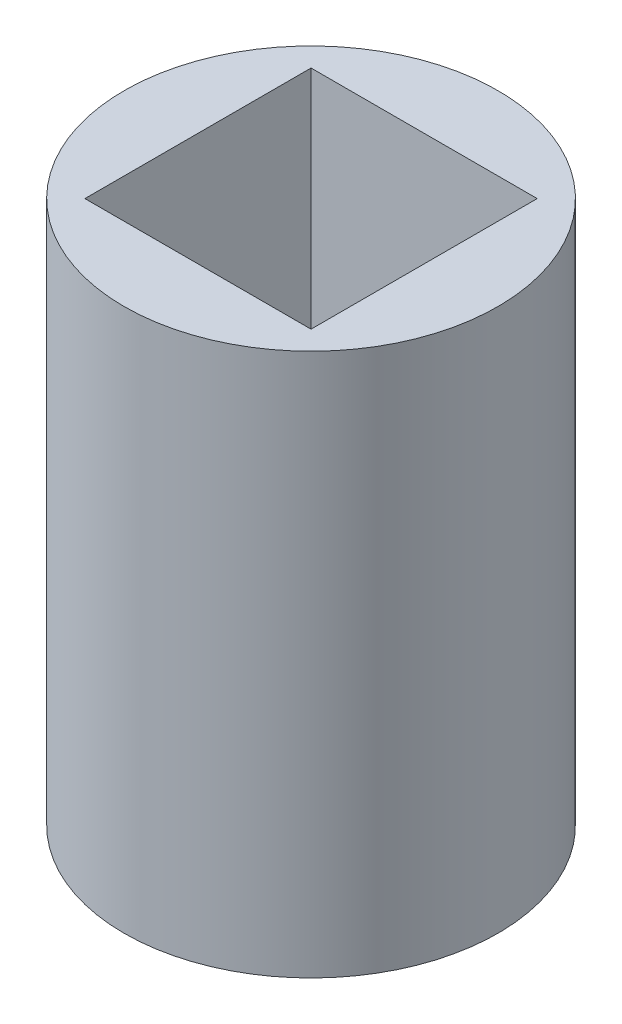
ISO-10303-21;
HEADER;
FILE_DESCRIPTION(('STEP AP214'),'2;1');
FILE_NAME('part.step','',(''),(''),'','','');
FILE_SCHEMA(('AUTOMOTIVE_DESIGN { 1 0 10303 214 1 1 1 1 }'));
ENDSEC;
DATA;
#1=APPLICATION_CONTEXT('core data for automotive mechanical design processes');
#2=APPLICATION_PROTOCOL_DEFINITION('international standard','automotive_design',2000,#1);
#3=PRODUCT_CONTEXT('',#1,'mechanical');
#4=PRODUCT('Part','Part','',(#3));
#5=PRODUCT_RELATED_PRODUCT_CATEGORY('part','',(#4));
#6=PRODUCT_DEFINITION_FORMATION('','',#4);
#7=PRODUCT_DEFINITION_CONTEXT('part definition',#1,'design');
#8=PRODUCT_DEFINITION('design','',#6,#7);
#9=PRODUCT_DEFINITION_SHAPE('','',#8);
#10=(LENGTH_UNIT() NAMED_UNIT(*) SI_UNIT(.MILLI.,.METRE.));
#11=(NAMED_UNIT(*) PLANE_ANGLE_UNIT() SI_UNIT($,.RADIAN.));
#12=(NAMED_UNIT(*) SI_UNIT($,.STERADIAN.) SOLID_ANGLE_UNIT());
#13=UNCERTAINTY_MEASURE_WITH_UNIT(LENGTH_MEASURE(1.E-05),#10,'distance_accuracy_value','');
#14=(GEOMETRIC_REPRESENTATION_CONTEXT(3) GLOBAL_UNCERTAINTY_ASSIGNED_CONTEXT((#13)) GLOBAL_UNIT_ASSIGNED_CONTEXT((#10,
#11,#12)) REPRESENTATION_CONTEXT('',''));
#15=CARTESIAN_POINT('',(0.,0.,0.));
#16=DIRECTION('',(0.,0.,1.));
#17=DIRECTION('',(1.,0.,0.));
#18=AXIS2_PLACEMENT_3D('',#15,#16,#17);
#19=CARTESIAN_POINT('',(0.,22.86,0.));
#20=DIRECTION('',(0.,1.,0.));
#21=DIRECTION('',(0.,0.,1.));
#22=AXIS2_PLACEMENT_3D('',#19,#20,#21);
#23=PLANE('',#22);
#24=CARTESIAN_POINT('',(0.,22.86,0.));
#25=DIRECTION('',(0.,1.,0.));
#26=DIRECTION('',(0.,0.,1.));
#27=AXIS2_PLACEMENT_3D('',#24,#25,#26);
#28=CIRCLE('',#27,7.87400000000001);
#29=CARTESIAN_POINT('',(0.,22.86,7.87400000000001));
#30=VERTEX_POINT('',#29);
#31=EDGE_CURVE('E11',#30,#30,#28,.T.);
#32=ORIENTED_EDGE('',*,*,#31,.T.);
#33=EDGE_LOOP('',(#32));
#34=FACE_BOUND('',#33,.T.);
#35=DIRECTION('',(-1.,0.,0.));
#36=VECTOR('',#35,1.);
#37=CARTESIAN_POINT('',(-4.7625,22.86,-4.7625));
#38=LINE('',#37,#36);
#39=CARTESIAN_POINT('',(4.7625,22.86,-4.7625));
#40=VERTEX_POINT('',#39);
#41=CARTESIAN_POINT('',(-4.7625,22.86,-4.7625));
#42=VERTEX_POINT('',#41);
#43=EDGE_CURVE('E81',#40,#42,#38,.T.);
#44=ORIENTED_EDGE('',*,*,#43,.F.);
#45=DIRECTION('',(0.,0.,-1.));
#46=VECTOR('',#45,1.);
#47=CARTESIAN_POINT('',(4.7625,22.86,4.7625));
#48=LINE('',#47,#46);
#49=CARTESIAN_POINT('',(4.7625,22.86,4.7625));
#50=VERTEX_POINT('',#49);
#51=EDGE_CURVE('E73',#50,#40,#48,.T.);
#52=ORIENTED_EDGE('',*,*,#51,.F.);
#53=DIRECTION('',(1.,0.,0.));
#54=VECTOR('',#53,1.);
#55=CARTESIAN_POINT('',(-4.7625,22.86,4.7625));
#56=LINE('',#55,#54);
#57=CARTESIAN_POINT('',(-4.7625,22.86,4.7625));
#58=VERTEX_POINT('',#57);
#59=EDGE_CURVE('E94',#58,#50,#56,.T.);
#60=ORIENTED_EDGE('',*,*,#59,.F.);
#61=DIRECTION('',(0.,0.,1.));
#62=VECTOR('',#61,1.);
#63=CARTESIAN_POINT('',(-4.7625,22.86,4.7625));
#64=LINE('',#63,#62);
#65=EDGE_CURVE('E92',#42,#58,#64,.T.);
#66=ORIENTED_EDGE('',*,*,#65,.F.);
#67=EDGE_LOOP('',(#44,#52,#60,#66));
#68=FACE_BOUND('',#67,.T.);
#69=ADVANCED_FACE('F32',(#34,#68),#23,.T.);
#70=CARTESIAN_POINT('',(0.,0.,0.));
#71=DIRECTION('',(0.,1.,0.));
#72=DIRECTION('',(0.,0.,1.));
#73=AXIS2_PLACEMENT_3D('',#70,#71,#72);
#74=PLANE('',#73);
#75=CARTESIAN_POINT('',(0.,0.,0.));
#76=DIRECTION('',(0.,1.,0.));
#77=DIRECTION('',(0.,0.,1.));
#78=AXIS2_PLACEMENT_3D('',#75,#76,#77);
#79=CIRCLE('',#78,7.87400000000001);
#80=CARTESIAN_POINT('',(0.,0.,7.87400000000001));
#81=VERTEX_POINT('',#80);
#82=EDGE_CURVE('E36',#81,#81,#79,.T.);
#83=ORIENTED_EDGE('',*,*,#82,.F.);
#84=EDGE_LOOP('',(#83));
#85=FACE_BOUND('',#84,.T.);
#86=DIRECTION('',(0.,0.,-1.));
#87=VECTOR('',#86,1.);
#88=CARTESIAN_POINT('',(4.7625,0.,4.7625));
#89=LINE('',#88,#87);
#90=CARTESIAN_POINT('',(4.7625,0.,4.7625));
#91=VERTEX_POINT('',#90);
#92=CARTESIAN_POINT('',(4.7625,0.,-4.7625));
#93=VERTEX_POINT('',#92);
#94=EDGE_CURVE('E55',#91,#93,#89,.T.);
#95=ORIENTED_EDGE('',*,*,#94,.T.);
#96=DIRECTION('',(-1.,0.,0.));
#97=VECTOR('',#96,1.);
#98=CARTESIAN_POINT('',(-4.7625,0.,-4.7625));
#99=LINE('',#98,#97);
#100=CARTESIAN_POINT('',(-4.7625,0.,-4.7625));
#101=VERTEX_POINT('',#100);
#102=EDGE_CURVE('E88',#93,#101,#99,.T.);
#103=ORIENTED_EDGE('',*,*,#102,.T.);
#104=DIRECTION('',(0.,0.,1.));
#105=VECTOR('',#104,1.);
#106=CARTESIAN_POINT('',(-4.7625,0.,4.7625));
#107=LINE('',#106,#105);
#108=CARTESIAN_POINT('',(-4.7625,0.,4.7625));
#109=VERTEX_POINT('',#108);
#110=EDGE_CURVE('E100',#101,#109,#107,.T.);
#111=ORIENTED_EDGE('',*,*,#110,.T.);
#112=DIRECTION('',(1.,0.,0.));
#113=VECTOR('',#112,1.);
#114=CARTESIAN_POINT('',(-4.7625,0.,4.7625));
#115=LINE('',#114,#113);
#116=EDGE_CURVE('E82',#109,#91,#115,.T.);
#117=ORIENTED_EDGE('',*,*,#116,.T.);
#118=EDGE_LOOP('',(#95,#103,#111,#117));
#119=FACE_BOUND('',#118,.T.);
#120=ADVANCED_FACE('F111',(#85,#119),#74,.F.);
#121=CARTESIAN_POINT('',(0.,22.86,0.));
#122=DIRECTION('',(0.,-1.,0.));
#123=DIRECTION('',(0.,0.,-1.));
#124=AXIS2_PLACEMENT_3D('',#121,#122,#123);
#125=CYLINDRICAL_SURFACE('',#124,7.87400000000001);
#126=ORIENTED_EDGE('',*,*,#31,.F.);
#127=EDGE_LOOP('',(#126));
#128=FACE_BOUND('',#127,.T.);
#129=ORIENTED_EDGE('',*,*,#82,.T.);
#130=EDGE_LOOP('',(#129));
#131=FACE_BOUND('',#130,.T.);
#132=ADVANCED_FACE('F34',(#128,#131),#125,.T.);
#133=CARTESIAN_POINT('',(4.7625,22.86,4.7625));
#134=DIRECTION('',(-1.,0.,0.));
#135=DIRECTION('',(0.,0.,1.));
#136=AXIS2_PLACEMENT_3D('',#133,#134,#135);
#137=PLANE('',#136);
#138=ORIENTED_EDGE('',*,*,#94,.F.);
#139=DIRECTION('',(0.,-1.,0.));
#140=VECTOR('',#139,1.);
#141=CARTESIAN_POINT('',(4.7625,22.86,4.7625));
#142=LINE('',#141,#140);
#143=EDGE_CURVE('E77',#50,#91,#142,.T.);
#144=ORIENTED_EDGE('',*,*,#143,.F.);
#145=ORIENTED_EDGE('',*,*,#51,.T.);
#146=DIRECTION('',(0.,-1.,0.));
#147=VECTOR('',#146,1.);
#148=CARTESIAN_POINT('',(4.7625,22.86,-4.7625));
#149=LINE('',#148,#147);
#150=EDGE_CURVE('E76',#40,#93,#149,.T.);
#151=ORIENTED_EDGE('',*,*,#150,.T.);
#152=EDGE_LOOP('',(#138,#144,#145,#151));
#153=FACE_BOUND('',#152,.T.);
#154=ADVANCED_FACE('F75',(#153),#137,.T.);
#155=CARTESIAN_POINT('',(-4.7625,22.86,-4.7625));
#156=DIRECTION('',(0.,0.,1.));
#157=DIRECTION('',(1.,0.,0.));
#158=AXIS2_PLACEMENT_3D('',#155,#156,#157);
#159=PLANE('',#158);
#160=ORIENTED_EDGE('',*,*,#102,.F.);
#161=ORIENTED_EDGE('',*,*,#150,.F.);
#162=ORIENTED_EDGE('',*,*,#43,.T.);
#163=DIRECTION('',(0.,-1.,0.));
#164=VECTOR('',#163,1.);
#165=CARTESIAN_POINT('',(-4.7625,22.86,-4.7625));
#166=LINE('',#165,#164);
#167=EDGE_CURVE('E89',#42,#101,#166,.T.);
#168=ORIENTED_EDGE('',*,*,#167,.T.);
#169=EDGE_LOOP('',(#160,#161,#162,#168));
#170=FACE_BOUND('',#169,.T.);
#171=ADVANCED_FACE('F85',(#170),#159,.T.);
#172=CARTESIAN_POINT('',(-4.7625,22.86,4.7625));
#173=DIRECTION('',(1.,0.,0.));
#174=DIRECTION('',(0.,0.,-1.));
#175=AXIS2_PLACEMENT_3D('',#172,#173,#174);
#176=PLANE('',#175);
#177=ORIENTED_EDGE('',*,*,#110,.F.);
#178=ORIENTED_EDGE('',*,*,#167,.F.);
#179=ORIENTED_EDGE('',*,*,#65,.T.);
#180=DIRECTION('',(0.,-1.,0.));
#181=VECTOR('',#180,1.);
#182=CARTESIAN_POINT('',(-4.7625,22.86,4.7625));
#183=LINE('',#182,#181);
#184=EDGE_CURVE('E47',#58,#109,#183,.T.);
#185=ORIENTED_EDGE('',*,*,#184,.T.);
#186=EDGE_LOOP('',(#177,#178,#179,#185));
#187=FACE_BOUND('',#186,.T.);
#188=ADVANCED_FACE('F109',(#187),#176,.T.);
#189=CARTESIAN_POINT('',(-4.7625,22.86,4.7625));
#190=DIRECTION('',(0.,0.,-1.));
#191=DIRECTION('',(-1.,0.,0.));
#192=AXIS2_PLACEMENT_3D('',#189,#190,#191);
#193=PLANE('',#192);
#194=ORIENTED_EDGE('',*,*,#116,.F.);
#195=ORIENTED_EDGE('',*,*,#184,.F.);
#196=ORIENTED_EDGE('',*,*,#59,.T.);
#197=ORIENTED_EDGE('',*,*,#143,.T.);
#198=EDGE_LOOP('',(#194,#195,#196,#197));
#199=FACE_BOUND('',#198,.T.);
#200=ADVANCED_FACE('F112',(#199),#193,.T.);
#201=CLOSED_SHELL('',(#69,#120,#132,#154,#171,#188,#200));
#202=MANIFOLD_SOLID_BREP('B2',#201);
#203=ADVANCED_BREP_SHAPE_REPRESENTATION('',(#18,#202),#14);
#204=SHAPE_DEFINITION_REPRESENTATION(#9,#203);
ENDSEC;
END-ISO-10303-21;
